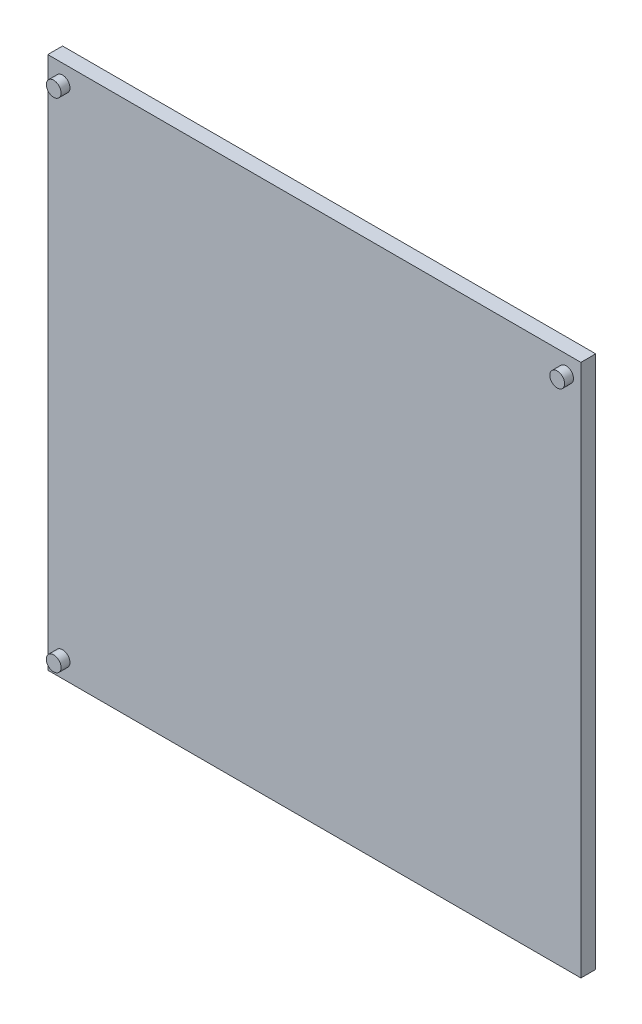
ISO-10303-21;
HEADER;
FILE_DESCRIPTION(('STEP AP214'),'2;1');
FILE_NAME('part.step','',(''),(''),'','','');
FILE_SCHEMA(('AUTOMOTIVE_DESIGN { 1 0 10303 214 1 1 1 1 }'));
ENDSEC;
DATA;
#1=APPLICATION_CONTEXT('core data for automotive mechanical design processes');
#2=APPLICATION_PROTOCOL_DEFINITION('international standard','automotive_design',2000,#1);
#3=PRODUCT_CONTEXT('',#1,'mechanical');
#4=PRODUCT('Part','Part','',(#3));
#5=PRODUCT_RELATED_PRODUCT_CATEGORY('part','',(#4));
#6=PRODUCT_DEFINITION_FORMATION('','',#4);
#7=PRODUCT_DEFINITION_CONTEXT('part definition',#1,'design');
#8=PRODUCT_DEFINITION('design','',#6,#7);
#9=PRODUCT_DEFINITION_SHAPE('','',#8);
#10=(LENGTH_UNIT() NAMED_UNIT(*) SI_UNIT(.MILLI.,.METRE.));
#11=(NAMED_UNIT(*) PLANE_ANGLE_UNIT() SI_UNIT($,.RADIAN.));
#12=(NAMED_UNIT(*) SI_UNIT($,.STERADIAN.) SOLID_ANGLE_UNIT());
#13=UNCERTAINTY_MEASURE_WITH_UNIT(LENGTH_MEASURE(1.E-05),#10,'distance_accuracy_value','');
#14=(GEOMETRIC_REPRESENTATION_CONTEXT(3) GLOBAL_UNCERTAINTY_ASSIGNED_CONTEXT((#13)) GLOBAL_UNIT_ASSIGNED_CONTEXT((#10,
#11,#12)) REPRESENTATION_CONTEXT('',''));
#15=CARTESIAN_POINT('',(0.,0.,0.));
#16=DIRECTION('',(0.,0.,1.));
#17=DIRECTION('',(1.,0.,0.));
#18=AXIS2_PLACEMENT_3D('',#15,#16,#17);
#19=CARTESIAN_POINT('',(45.,-45.,2.5));
#20=DIRECTION('',(-1.,0.,0.));
#21=DIRECTION('',(0.,0.,1.));
#22=AXIS2_PLACEMENT_3D('',#19,#20,#21);
#23=PLANE('',#22);
#24=DIRECTION('',(0.,1.,0.));
#25=VECTOR('',#24,1.);
#26=CARTESIAN_POINT('',(45.,-45.,0.));
#27=LINE('',#26,#25);
#28=CARTESIAN_POINT('',(45.,-45.,0.));
#29=VERTEX_POINT('',#28);
#30=CARTESIAN_POINT('',(45.,45.,0.));
#31=VERTEX_POINT('',#30);
#32=EDGE_CURVE('E117',#29,#31,#27,.T.);
#33=ORIENTED_EDGE('',*,*,#32,.T.);
#34=DIRECTION('',(0.,0.,-1.));
#35=VECTOR('',#34,1.);
#36=CARTESIAN_POINT('',(45.,45.,2.5));
#37=LINE('',#36,#35);
#38=CARTESIAN_POINT('',(45.,45.,2.5));
#39=VERTEX_POINT('',#38);
#40=EDGE_CURVE('E106',#39,#31,#37,.T.);
#41=ORIENTED_EDGE('',*,*,#40,.F.);
#42=DIRECTION('',(0.,1.,0.));
#43=VECTOR('',#42,1.);
#44=CARTESIAN_POINT('',(45.,-45.,2.5));
#45=LINE('',#44,#43);
#46=CARTESIAN_POINT('',(45.,-45.,2.5));
#47=VERTEX_POINT('',#46);
#48=EDGE_CURVE('E98',#47,#39,#45,.T.);
#49=ORIENTED_EDGE('',*,*,#48,.F.);
#50=DIRECTION('',(0.,0.,-1.));
#51=VECTOR('',#50,1.);
#52=CARTESIAN_POINT('',(45.,-45.,2.5));
#53=LINE('',#52,#51);
#54=EDGE_CURVE('E113',#47,#29,#53,.T.);
#55=ORIENTED_EDGE('',*,*,#54,.T.);
#56=EDGE_LOOP('',(#33,#41,#49,#55));
#57=FACE_BOUND('',#56,.T.);
#58=ADVANCED_FACE('F45',(#57),#23,.F.);
#59=CARTESIAN_POINT('',(-45.,45.,2.5));
#60=DIRECTION('',(0.,-1.,0.));
#61=DIRECTION('',(0.,0.,-1.));
#62=AXIS2_PLACEMENT_3D('',#59,#60,#61);
#63=PLANE('',#62);
#64=DIRECTION('',(-1.,0.,0.));
#65=VECTOR('',#64,1.);
#66=CARTESIAN_POINT('',(-45.,45.,0.));
#67=LINE('',#66,#65);
#68=CARTESIAN_POINT('',(-45.,45.,0.));
#69=VERTEX_POINT('',#68);
#70=EDGE_CURVE('E104',#31,#69,#67,.T.);
#71=ORIENTED_EDGE('',*,*,#70,.T.);
#72=DIRECTION('',(0.,0.,-1.));
#73=VECTOR('',#72,1.);
#74=CARTESIAN_POINT('',(-45.,45.,2.5));
#75=LINE('',#74,#73);
#76=CARTESIAN_POINT('',(-45.,45.,2.5));
#77=VERTEX_POINT('',#76);
#78=EDGE_CURVE('E102',#77,#69,#75,.T.);
#79=ORIENTED_EDGE('',*,*,#78,.F.);
#80=DIRECTION('',(-1.,0.,0.));
#81=VECTOR('',#80,1.);
#82=CARTESIAN_POINT('',(-45.,45.,2.5));
#83=LINE('',#82,#81);
#84=EDGE_CURVE('E93',#39,#77,#83,.T.);
#85=ORIENTED_EDGE('',*,*,#84,.F.);
#86=ORIENTED_EDGE('',*,*,#40,.T.);
#87=EDGE_LOOP('',(#71,#79,#85,#86));
#88=FACE_BOUND('',#87,.T.);
#89=ADVANCED_FACE('F103',(#88),#63,.F.);
#90=CARTESIAN_POINT('',(-45.,-45.,2.5));
#91=DIRECTION('',(1.,0.,0.));
#92=DIRECTION('',(0.,0.,-1.));
#93=AXIS2_PLACEMENT_3D('',#90,#91,#92);
#94=PLANE('',#93);
#95=DIRECTION('',(0.,-1.,0.));
#96=VECTOR('',#95,1.);
#97=CARTESIAN_POINT('',(-45.,-45.,0.));
#98=LINE('',#97,#96);
#99=CARTESIAN_POINT('',(-45.,-45.,0.));
#100=VERTEX_POINT('',#99);
#101=EDGE_CURVE('E79',#69,#100,#98,.T.);
#102=ORIENTED_EDGE('',*,*,#101,.T.);
#103=DIRECTION('',(0.,0.,-1.));
#104=VECTOR('',#103,1.);
#105=CARTESIAN_POINT('',(-45.,-45.,2.5));
#106=LINE('',#105,#104);
#107=CARTESIAN_POINT('',(-45.,-45.,2.5));
#108=VERTEX_POINT('',#107);
#109=EDGE_CURVE('E107',#108,#100,#106,.T.);
#110=ORIENTED_EDGE('',*,*,#109,.F.);
#111=DIRECTION('',(0.,-1.,0.));
#112=VECTOR('',#111,1.);
#113=CARTESIAN_POINT('',(-45.,-45.,2.5));
#114=LINE('',#113,#112);
#115=EDGE_CURVE('E96',#77,#108,#114,.T.);
#116=ORIENTED_EDGE('',*,*,#115,.F.);
#117=ORIENTED_EDGE('',*,*,#78,.T.);
#118=EDGE_LOOP('',(#102,#110,#116,#117));
#119=FACE_BOUND('',#118,.T.);
#120=ADVANCED_FACE('F109',(#119),#94,.F.);
#121=CARTESIAN_POINT('',(-45.,-45.,2.5));
#122=DIRECTION('',(0.,1.,0.));
#123=DIRECTION('',(0.,0.,1.));
#124=AXIS2_PLACEMENT_3D('',#121,#122,#123);
#125=PLANE('',#124);
#126=DIRECTION('',(1.,0.,0.));
#127=VECTOR('',#126,1.);
#128=CARTESIAN_POINT('',(-45.,-45.,0.));
#129=LINE('',#128,#127);
#130=EDGE_CURVE('E85',#100,#29,#129,.T.);
#131=ORIENTED_EDGE('',*,*,#130,.T.);
#132=ORIENTED_EDGE('',*,*,#54,.F.);
#133=DIRECTION('',(1.,0.,0.));
#134=VECTOR('',#133,1.);
#135=CARTESIAN_POINT('',(-45.,-45.,2.5));
#136=LINE('',#135,#134);
#137=EDGE_CURVE('E62',#108,#47,#136,.T.);
#138=ORIENTED_EDGE('',*,*,#137,.F.);
#139=ORIENTED_EDGE('',*,*,#109,.T.);
#140=EDGE_LOOP('',(#131,#132,#138,#139));
#141=FACE_BOUND('',#140,.T.);
#142=ADVANCED_FACE('F146',(#141),#125,.F.);
#143=CARTESIAN_POINT('',(0.,0.,2.5));
#144=DIRECTION('',(0.,0.,-1.));
#145=DIRECTION('',(-1.,0.,0.));
#146=AXIS2_PLACEMENT_3D('',#143,#144,#145);
#147=PLANE('',#146);
#148=CARTESIAN_POINT('',(-42.5,-42.,2.5));
#149=DIRECTION('',(0.,0.,-1.));
#150=DIRECTION('',(-1.,0.,0.));
#151=AXIS2_PLACEMENT_3D('',#148,#149,#150);
#152=CIRCLE('',#151,1.25);
#153=CARTESIAN_POINT('',(-43.75,-42.,2.5));
#154=VERTEX_POINT('',#153);
#155=EDGE_CURVE('E11',#154,#154,#152,.F.);
#156=ORIENTED_EDGE('',*,*,#155,.F.);
#157=EDGE_LOOP('',(#156));
#158=FACE_BOUND('',#157,.T.);
#159=CARTESIAN_POINT('',(42.5,42.,2.5));
#160=DIRECTION('',(0.,0.,-1.));
#161=DIRECTION('',(-1.,0.,0.));
#162=AXIS2_PLACEMENT_3D('',#159,#160,#161);
#163=CIRCLE('',#162,1.25);
#164=CARTESIAN_POINT('',(41.25,42.,2.5));
#165=VERTEX_POINT('',#164);
#166=EDGE_CURVE('E54',#165,#165,#163,.F.);
#167=ORIENTED_EDGE('',*,*,#166,.F.);
#168=EDGE_LOOP('',(#167));
#169=FACE_BOUND('',#168,.T.);
#170=CARTESIAN_POINT('',(-42.5,42.,2.5));
#171=DIRECTION('',(0.,0.,-1.));
#172=DIRECTION('',(-1.,0.,0.));
#173=AXIS2_PLACEMENT_3D('',#170,#171,#172);
#174=CIRCLE('',#173,1.25);
#175=CARTESIAN_POINT('',(-43.75,42.,2.5));
#176=VERTEX_POINT('',#175);
#177=EDGE_CURVE('E134',#176,#176,#174,.F.);
#178=ORIENTED_EDGE('',*,*,#177,.F.);
#179=EDGE_LOOP('',(#178));
#180=FACE_BOUND('',#179,.T.);
#181=ORIENTED_EDGE('',*,*,#48,.T.);
#182=ORIENTED_EDGE('',*,*,#84,.T.);
#183=ORIENTED_EDGE('',*,*,#115,.T.);
#184=ORIENTED_EDGE('',*,*,#137,.T.);
#185=EDGE_LOOP('',(#181,#182,#183,#184));
#186=FACE_BOUND('',#185,.T.);
#187=ADVANCED_FACE('F94',(#158,#169,#180,#186),#147,.F.);
#188=CARTESIAN_POINT('',(0.,0.,0.));
#189=DIRECTION('',(0.,0.,-1.));
#190=DIRECTION('',(-1.,0.,0.));
#191=AXIS2_PLACEMENT_3D('',#188,#189,#190);
#192=PLANE('',#191);
#193=ORIENTED_EDGE('',*,*,#32,.F.);
#194=ORIENTED_EDGE('',*,*,#130,.F.);
#195=ORIENTED_EDGE('',*,*,#101,.F.);
#196=ORIENTED_EDGE('',*,*,#70,.F.);
#197=EDGE_LOOP('',(#193,#194,#195,#196));
#198=FACE_BOUND('',#197,.T.);
#199=ADVANCED_FACE('F145',(#198),#192,.T.);
#200=CARTESIAN_POINT('',(-42.5,42.,4.));
#201=DIRECTION('',(0.,0.,-1.));
#202=DIRECTION('',(-1.,0.,0.));
#203=AXIS2_PLACEMENT_3D('',#200,#201,#202);
#204=CYLINDRICAL_SURFACE('',#203,1.25);
#205=CARTESIAN_POINT('',(-42.5,42.,4.));
#206=DIRECTION('',(0.,0.,1.));
#207=DIRECTION('',(1.,0.,0.));
#208=AXIS2_PLACEMENT_3D('',#205,#206,#207);
#209=CIRCLE('',#208,1.25);
#210=CARTESIAN_POINT('',(-41.25,42.,4.));
#211=VERTEX_POINT('',#210);
#212=EDGE_CURVE('E121',#211,#211,#209,.T.);
#213=ORIENTED_EDGE('',*,*,#212,.F.);
#214=EDGE_LOOP('',(#213));
#215=FACE_BOUND('',#214,.T.);
#216=ORIENTED_EDGE('',*,*,#177,.T.);
#217=EDGE_LOOP('',(#216));
#218=FACE_BOUND('',#217,.T.);
#219=ADVANCED_FACE('F151',(#215,#218),#204,.T.);
#220=CARTESIAN_POINT('',(-42.5,42.,4.));
#221=DIRECTION('',(0.,0.,1.));
#222=DIRECTION('',(1.,0.,0.));
#223=AXIS2_PLACEMENT_3D('',#220,#221,#222);
#224=PLANE('',#223);
#225=ORIENTED_EDGE('',*,*,#212,.T.);
#226=EDGE_LOOP('',(#225));
#227=FACE_BOUND('',#226,.T.);
#228=ADVANCED_FACE('F153',(#227),#224,.T.);
#229=CARTESIAN_POINT('',(42.5,42.,4.));
#230=DIRECTION('',(0.,0.,-1.));
#231=DIRECTION('',(-1.,0.,0.));
#232=AXIS2_PLACEMENT_3D('',#229,#230,#231);
#233=CYLINDRICAL_SURFACE('',#232,1.25);
#234=CARTESIAN_POINT('',(42.5,42.,4.));
#235=DIRECTION('',(0.,0.,1.));
#236=DIRECTION('',(-1.,0.,0.));
#237=AXIS2_PLACEMENT_3D('',#234,#235,#236);
#238=CIRCLE('',#237,1.25);
#239=CARTESIAN_POINT('',(41.25,42.,4.));
#240=VERTEX_POINT('',#239);
#241=EDGE_CURVE('E260',#240,#240,#238,.T.);
#242=ORIENTED_EDGE('',*,*,#241,.F.);
#243=EDGE_LOOP('',(#242));
#244=FACE_BOUND('',#243,.T.);
#245=ORIENTED_EDGE('',*,*,#166,.T.);
#246=EDGE_LOOP('',(#245));
#247=FACE_BOUND('',#246,.T.);
#248=ADVANCED_FACE('F141',(#244,#247),#233,.T.);
#249=CARTESIAN_POINT('',(42.5,42.,4.));
#250=DIRECTION('',(0.,0.,-1.));
#251=DIRECTION('',(-1.,0.,0.));
#252=AXIS2_PLACEMENT_3D('',#249,#250,#251);
#253=PLANE('',#252);
#254=ORIENTED_EDGE('',*,*,#241,.T.);
#255=EDGE_LOOP('',(#254));
#256=FACE_BOUND('',#255,.T.);
#257=ADVANCED_FACE('F221',(#256),#253,.F.);
#258=CARTESIAN_POINT('',(-42.5,-42.,4.));
#259=DIRECTION('',(0.,0.,-1.));
#260=DIRECTION('',(-1.,0.,0.));
#261=AXIS2_PLACEMENT_3D('',#258,#259,#260);
#262=CYLINDRICAL_SURFACE('',#261,1.25);
#263=CARTESIAN_POINT('',(-42.5,-42.,4.));
#264=DIRECTION('',(0.,0.,1.));
#265=DIRECTION('',(-1.,0.,0.));
#266=AXIS2_PLACEMENT_3D('',#263,#264,#265);
#267=CIRCLE('',#266,1.25);
#268=CARTESIAN_POINT('',(-43.75,-42.,4.));
#269=VERTEX_POINT('',#268);
#270=EDGE_CURVE('E258',#269,#269,#267,.T.);
#271=ORIENTED_EDGE('',*,*,#270,.F.);
#272=EDGE_LOOP('',(#271));
#273=FACE_BOUND('',#272,.T.);
#274=ORIENTED_EDGE('',*,*,#155,.T.);
#275=EDGE_LOOP('',(#274));
#276=FACE_BOUND('',#275,.T.);
#277=ADVANCED_FACE('F230',(#273,#276),#262,.T.);
#278=CARTESIAN_POINT('',(-42.5,-42.,4.));
#279=DIRECTION('',(0.,0.,-1.));
#280=DIRECTION('',(-1.,0.,0.));
#281=AXIS2_PLACEMENT_3D('',#278,#279,#280);
#282=PLANE('',#281);
#283=ORIENTED_EDGE('',*,*,#270,.T.);
#284=EDGE_LOOP('',(#283));
#285=FACE_BOUND('',#284,.T.);
#286=ADVANCED_FACE('F239',(#285),#282,.F.);
#287=CLOSED_SHELL('',(#58,#89,#120,#142,#187,#199,#219,#228,#248,#257,#277,#286));
#288=MANIFOLD_SOLID_BREP('B2',#287);
#289=ADVANCED_BREP_SHAPE_REPRESENTATION('',(#18,#288),#14);
#290=SHAPE_DEFINITION_REPRESENTATION(#9,#289);
ENDSEC;
END-ISO-10303-21;
